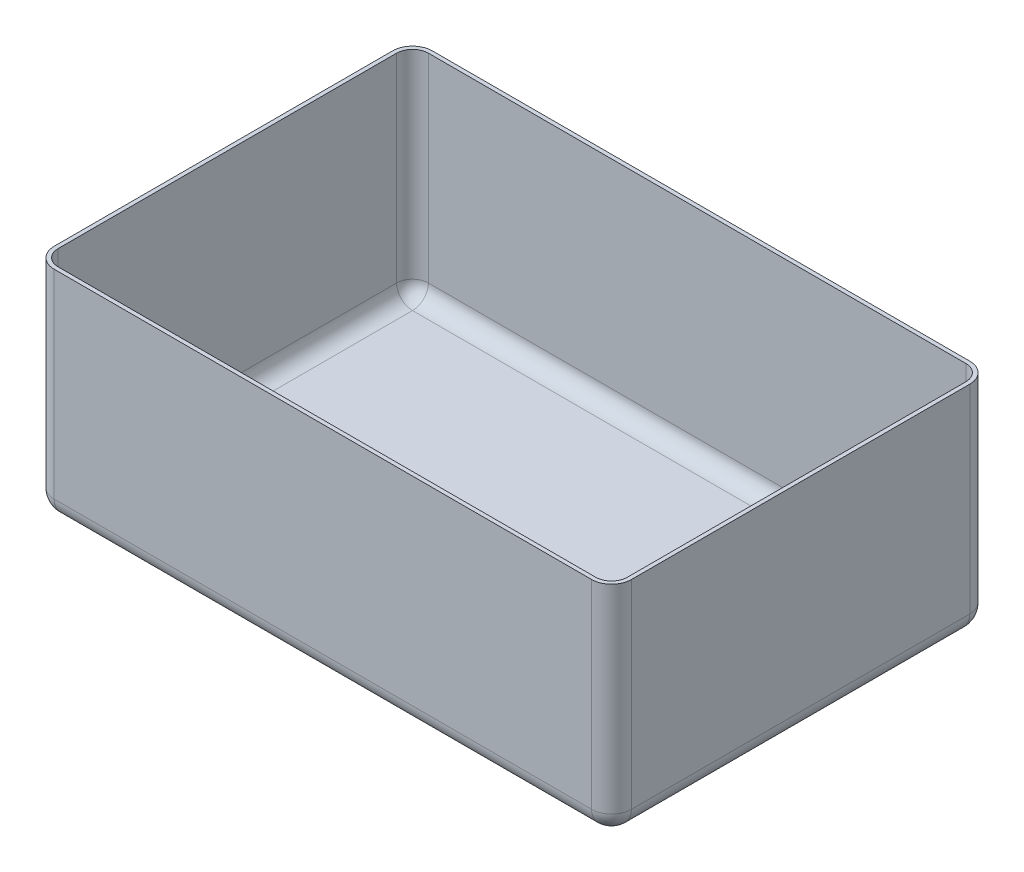
ISO-10303-21;
HEADER;
FILE_DESCRIPTION(('STEP AP214'),'2;1');
FILE_NAME('part.step','',(''),(''),'','','');
FILE_SCHEMA(('AUTOMOTIVE_DESIGN { 1 0 10303 214 1 1 1 1 }'));
ENDSEC;
DATA;
#1=APPLICATION_CONTEXT('core data for automotive mechanical design processes');
#2=APPLICATION_PROTOCOL_DEFINITION('international standard','automotive_design',2000,#1);
#3=PRODUCT_CONTEXT('',#1,'mechanical');
#4=PRODUCT('Part','Part','',(#3));
#5=PRODUCT_RELATED_PRODUCT_CATEGORY('part','',(#4));
#6=PRODUCT_DEFINITION_FORMATION('','',#4);
#7=PRODUCT_DEFINITION_CONTEXT('part definition',#1,'design');
#8=PRODUCT_DEFINITION('design','',#6,#7);
#9=PRODUCT_DEFINITION_SHAPE('','',#8);
#10=(LENGTH_UNIT() NAMED_UNIT(*) SI_UNIT(.MILLI.,.METRE.));
#11=(NAMED_UNIT(*) PLANE_ANGLE_UNIT() SI_UNIT($,.RADIAN.));
#12=(NAMED_UNIT(*) SI_UNIT($,.STERADIAN.) SOLID_ANGLE_UNIT());
#13=UNCERTAINTY_MEASURE_WITH_UNIT(LENGTH_MEASURE(1.E-05),#10,'distance_accuracy_value','');
#14=(GEOMETRIC_REPRESENTATION_CONTEXT(3) GLOBAL_UNCERTAINTY_ASSIGNED_CONTEXT((#13)) GLOBAL_UNIT_ASSIGNED_CONTEXT((#10,
#11,#12)) REPRESENTATION_CONTEXT('',''));
#15=CARTESIAN_POINT('',(0.,0.,0.));
#16=DIRECTION('',(0.,0.,1.));
#17=DIRECTION('',(1.,0.,0.));
#18=AXIS2_PLACEMENT_3D('',#15,#16,#17);
#19=CARTESIAN_POINT('',(184.15,139.7,120.65));
#20=DIRECTION('',(-1.,0.,0.));
#21=DIRECTION('',(0.,0.,1.));
#22=AXIS2_PLACEMENT_3D('',#19,#20,#21);
#23=PLANE('',#22);
#24=DIRECTION('',(0.,0.,-1.));
#25=VECTOR('',#24,1.);
#26=CARTESIAN_POINT('',(184.15,12.7,-120.65));
#27=LINE('',#26,#25);
#28=CARTESIAN_POINT('',(184.15,12.7,107.95));
#29=VERTEX_POINT('',#28);
#30=CARTESIAN_POINT('',(184.15,12.7,-107.95));
#31=VERTEX_POINT('',#30);
#32=EDGE_CURVE('E57',#29,#31,#27,.T.);
#33=ORIENTED_EDGE('',*,*,#32,.T.);
#34=DIRECTION('',(0.,-1.,0.));
#35=VECTOR('',#34,1.);
#36=CARTESIAN_POINT('',(184.15,139.7,-107.95));
#37=LINE('',#36,#35);
#38=CARTESIAN_POINT('',(184.15,139.7,-107.95));
#39=VERTEX_POINT('',#38);
#40=EDGE_CURVE('E285',#31,#39,#37,.F.);
#41=ORIENTED_EDGE('',*,*,#40,.T.);
#42=DIRECTION('',(0.,0.,-1.));
#43=VECTOR('',#42,1.);
#44=CARTESIAN_POINT('',(184.15,139.7,120.65));
#45=LINE('',#44,#43);
#46=CARTESIAN_POINT('',(184.15,139.7,107.95));
#47=VERTEX_POINT('',#46);
#48=EDGE_CURVE('E242',#47,#39,#45,.T.);
#49=ORIENTED_EDGE('',*,*,#48,.F.);
#50=DIRECTION('',(0.,-1.,0.));
#51=VECTOR('',#50,1.);
#52=CARTESIAN_POINT('',(184.15,139.7,107.95));
#53=LINE('',#52,#51);
#54=EDGE_CURVE('E282',#47,#29,#53,.T.);
#55=ORIENTED_EDGE('',*,*,#54,.T.);
#56=EDGE_LOOP('',(#33,#41,#49,#55));
#57=FACE_BOUND('',#56,.T.);
#58=ADVANCED_FACE('F32',(#57),#23,.F.);
#59=CARTESIAN_POINT('',(-184.15,139.7,-120.65));
#60=DIRECTION('',(0.,0.,1.));
#61=DIRECTION('',(1.,0.,0.));
#62=AXIS2_PLACEMENT_3D('',#59,#60,#61);
#63=PLANE('',#62);
#64=DIRECTION('',(-1.,0.,0.));
#65=VECTOR('',#64,1.);
#66=CARTESIAN_POINT('',(-184.15,139.7,-120.65));
#67=LINE('',#66,#65);
#68=CARTESIAN_POINT('',(171.45,139.7,-120.65));
#69=VERTEX_POINT('',#68);
#70=CARTESIAN_POINT('',(-171.45,139.7,-120.65));
#71=VERTEX_POINT('',#70);
#72=EDGE_CURVE('E245',#69,#71,#67,.T.);
#73=ORIENTED_EDGE('',*,*,#72,.F.);
#74=DIRECTION('',(0.,-1.,0.));
#75=VECTOR('',#74,1.);
#76=CARTESIAN_POINT('',(171.45,139.7,-120.65));
#77=LINE('',#76,#75);
#78=CARTESIAN_POINT('',(171.45,12.7,-120.65));
#79=VERTEX_POINT('',#78);
#80=EDGE_CURVE('E259',#69,#79,#77,.T.);
#81=ORIENTED_EDGE('',*,*,#80,.T.);
#82=DIRECTION('',(-1.,0.,0.));
#83=VECTOR('',#82,1.);
#84=CARTESIAN_POINT('',(-184.15,12.7,-120.65));
#85=LINE('',#84,#83);
#86=CARTESIAN_POINT('',(-171.45,12.7,-120.65));
#87=VERTEX_POINT('',#86);
#88=EDGE_CURVE('E256',#79,#87,#85,.T.);
#89=ORIENTED_EDGE('',*,*,#88,.T.);
#90=DIRECTION('',(0.,-1.,0.));
#91=VECTOR('',#90,1.);
#92=CARTESIAN_POINT('',(-171.45,139.7,-120.65));
#93=LINE('',#92,#91);
#94=EDGE_CURVE('E254',#87,#71,#93,.F.);
#95=ORIENTED_EDGE('',*,*,#94,.T.);
#96=EDGE_LOOP('',(#73,#81,#89,#95));
#97=FACE_BOUND('',#96,.T.);
#98=ADVANCED_FACE('F384',(#97),#63,.F.);
#99=CARTESIAN_POINT('',(-184.15,139.7,120.65));
#100=DIRECTION('',(1.,0.,0.));
#101=DIRECTION('',(0.,0.,-1.));
#102=AXIS2_PLACEMENT_3D('',#99,#100,#101);
#103=PLANE('',#102);
#104=DIRECTION('',(0.,0.,1.));
#105=VECTOR('',#104,1.);
#106=CARTESIAN_POINT('',(-184.15,139.7,120.65));
#107=LINE('',#106,#105);
#108=CARTESIAN_POINT('',(-184.15,139.7,-107.95));
#109=VERTEX_POINT('',#108);
#110=CARTESIAN_POINT('',(-184.15,139.7,107.95));
#111=VERTEX_POINT('',#110);
#112=EDGE_CURVE('E248',#109,#111,#107,.T.);
#113=ORIENTED_EDGE('',*,*,#112,.F.);
#114=DIRECTION('',(0.,-1.,0.));
#115=VECTOR('',#114,1.);
#116=CARTESIAN_POINT('',(-184.15,139.7,-107.95));
#117=LINE('',#116,#115);
#118=CARTESIAN_POINT('',(-184.15,12.7,-107.95));
#119=VERTEX_POINT('',#118);
#120=EDGE_CURVE('E274',#109,#119,#117,.T.);
#121=ORIENTED_EDGE('',*,*,#120,.T.);
#122=DIRECTION('',(0.,0.,1.));
#123=VECTOR('',#122,1.);
#124=CARTESIAN_POINT('',(-184.15,12.7,120.65));
#125=LINE('',#124,#123);
#126=CARTESIAN_POINT('',(-184.15,12.7,107.95));
#127=VERTEX_POINT('',#126);
#128=EDGE_CURVE('E272',#119,#127,#125,.T.);
#129=ORIENTED_EDGE('',*,*,#128,.T.);
#130=DIRECTION('',(0.,-1.,0.));
#131=VECTOR('',#130,1.);
#132=CARTESIAN_POINT('',(-184.15,139.7,107.95));
#133=LINE('',#132,#131);
#134=EDGE_CURVE('E270',#127,#111,#133,.F.);
#135=ORIENTED_EDGE('',*,*,#134,.T.);
#136=EDGE_LOOP('',(#113,#121,#129,#135));
#137=FACE_BOUND('',#136,.T.);
#138=ADVANCED_FACE('F387',(#137),#103,.F.);
#139=CARTESIAN_POINT('',(-184.15,139.7,120.65));
#140=DIRECTION('',(0.,0.,-1.));
#141=DIRECTION('',(-1.,0.,0.));
#142=AXIS2_PLACEMENT_3D('',#139,#140,#141);
#143=PLANE('',#142);
#144=DIRECTION('',(1.,0.,0.));
#145=VECTOR('',#144,1.);
#146=CARTESIAN_POINT('',(184.15,12.7,120.65));
#147=LINE('',#146,#145);
#148=CARTESIAN_POINT('',(-171.45,12.7,120.65));
#149=VERTEX_POINT('',#148);
#150=CARTESIAN_POINT('',(171.45,12.7,120.65));
#151=VERTEX_POINT('',#150);
#152=EDGE_CURVE('E278',#149,#151,#147,.T.);
#153=ORIENTED_EDGE('',*,*,#152,.T.);
#154=DIRECTION('',(0.,-1.,0.));
#155=VECTOR('',#154,1.);
#156=CARTESIAN_POINT('',(171.45,139.7,120.65));
#157=LINE('',#156,#155);
#158=CARTESIAN_POINT('',(171.45,139.7,120.65));
#159=VERTEX_POINT('',#158);
#160=EDGE_CURVE('E280',#151,#159,#157,.F.);
#161=ORIENTED_EDGE('',*,*,#160,.T.);
#162=DIRECTION('',(1.,0.,0.));
#163=VECTOR('',#162,1.);
#164=CARTESIAN_POINT('',(-184.15,139.7,120.65));
#165=LINE('',#164,#163);
#166=CARTESIAN_POINT('',(-171.45,139.7,120.65));
#167=VERTEX_POINT('',#166);
#168=EDGE_CURVE('E251',#167,#159,#165,.T.);
#169=ORIENTED_EDGE('',*,*,#168,.F.);
#170=DIRECTION('',(0.,-1.,0.));
#171=VECTOR('',#170,1.);
#172=CARTESIAN_POINT('',(-171.45,139.7,120.65));
#173=LINE('',#172,#171);
#174=EDGE_CURVE('E276',#167,#149,#173,.T.);
#175=ORIENTED_EDGE('',*,*,#174,.T.);
#176=EDGE_LOOP('',(#153,#161,#169,#175));
#177=FACE_BOUND('',#176,.T.);
#178=ADVANCED_FACE('F352',(#177),#143,.F.);
#179=CARTESIAN_POINT('',(0.,139.7,0.));
#180=DIRECTION('',(0.,-1.,0.));
#181=DIRECTION('',(0.,0.,-1.));
#182=AXIS2_PLACEMENT_3D('',#179,#180,#181);
#183=PLANE('',#182);
#184=DIRECTION('',(0.,0.,-1.));
#185=VECTOR('',#184,1.);
#186=CARTESIAN_POINT('',(181.61,139.7,0.));
#187=LINE('',#186,#185);
#188=CARTESIAN_POINT('',(181.61,139.7,107.95));
#189=VERTEX_POINT('',#188);
#190=CARTESIAN_POINT('',(181.61,139.7,-107.95));
#191=VERTEX_POINT('',#190);
#192=EDGE_CURVE('E189',#189,#191,#187,.T.);
#193=ORIENTED_EDGE('',*,*,#192,.F.);
#194=CARTESIAN_POINT('',(171.45,139.7,107.95));
#195=DIRECTION('',(0.,-1.,0.));
#196=DIRECTION('',(0.,0.,-1.));
#197=AXIS2_PLACEMENT_3D('',#194,#195,#196);
#198=CIRCLE('',#197,10.16);
#199=CARTESIAN_POINT('',(171.45,139.7,118.11));
#200=VERTEX_POINT('',#199);
#201=EDGE_CURVE('E231',#200,#189,#198,.F.);
#202=ORIENTED_EDGE('',*,*,#201,.F.);
#203=DIRECTION('',(1.,0.,0.));
#204=VECTOR('',#203,1.);
#205=CARTESIAN_POINT('',(0.,139.7,118.11));
#206=LINE('',#205,#204);
#207=CARTESIAN_POINT('',(-171.45,139.7,118.11));
#208=VERTEX_POINT('',#207);
#209=EDGE_CURVE('E49',#208,#200,#206,.T.);
#210=ORIENTED_EDGE('',*,*,#209,.F.);
#211=CARTESIAN_POINT('',(-171.45,139.7,107.95));
#212=DIRECTION('',(0.,-1.,0.));
#213=DIRECTION('',(0.,0.,-1.));
#214=AXIS2_PLACEMENT_3D('',#211,#212,#213);
#215=CIRCLE('',#214,10.16);
#216=CARTESIAN_POINT('',(-181.61,139.7,107.95));
#217=VERTEX_POINT('',#216);
#218=EDGE_CURVE('E193',#217,#208,#215,.F.);
#219=ORIENTED_EDGE('',*,*,#218,.F.);
#220=DIRECTION('',(0.,0.,1.));
#221=VECTOR('',#220,1.);
#222=CARTESIAN_POINT('',(-181.61,139.7,0.));
#223=LINE('',#222,#221);
#224=CARTESIAN_POINT('',(-181.61,139.7,-107.95));
#225=VERTEX_POINT('',#224);
#226=EDGE_CURVE('E234',#225,#217,#223,.T.);
#227=ORIENTED_EDGE('',*,*,#226,.F.);
#228=CARTESIAN_POINT('',(-171.45,139.7,-107.95));
#229=DIRECTION('',(0.,-1.,0.));
#230=DIRECTION('',(0.,0.,-1.));
#231=AXIS2_PLACEMENT_3D('',#228,#229,#230);
#232=CIRCLE('',#231,10.16);
#233=CARTESIAN_POINT('',(-171.45,139.7,-118.11));
#234=VERTEX_POINT('',#233);
#235=EDGE_CURVE('E235',#234,#225,#232,.F.);
#236=ORIENTED_EDGE('',*,*,#235,.F.);
#237=DIRECTION('',(-1.,0.,0.));
#238=VECTOR('',#237,1.);
#239=CARTESIAN_POINT('',(0.,139.7,-118.11));
#240=LINE('',#239,#238);
#241=CARTESIAN_POINT('',(171.45,139.7,-118.11));
#242=VERTEX_POINT('',#241);
#243=EDGE_CURVE('E226',#242,#234,#240,.T.);
#244=ORIENTED_EDGE('',*,*,#243,.F.);
#245=CARTESIAN_POINT('',(171.45,139.7,-107.95));
#246=DIRECTION('',(0.,-1.,0.));
#247=DIRECTION('',(0.,0.,-1.));
#248=AXIS2_PLACEMENT_3D('',#245,#246,#247);
#249=CIRCLE('',#248,10.16);
#250=EDGE_CURVE('E228',#191,#242,#249,.F.);
#251=ORIENTED_EDGE('',*,*,#250,.F.);
#252=EDGE_LOOP('',(#193,#202,#210,#219,#227,#236,#244,#251));
#253=FACE_BOUND('',#252,.T.);
#254=ORIENTED_EDGE('',*,*,#48,.T.);
#255=CARTESIAN_POINT('',(171.45,139.7,-107.95));
#256=DIRECTION('',(0.,-1.,0.));
#257=DIRECTION('',(0.,0.,-1.));
#258=AXIS2_PLACEMENT_3D('',#255,#256,#257);
#259=CIRCLE('',#258,12.7);
#260=EDGE_CURVE('E11',#39,#69,#259,.F.);
#261=ORIENTED_EDGE('',*,*,#260,.T.);
#262=ORIENTED_EDGE('',*,*,#72,.T.);
#263=CARTESIAN_POINT('',(-171.45,139.7,-107.95));
#264=DIRECTION('',(0.,-1.,0.));
#265=DIRECTION('',(0.,0.,-1.));
#266=AXIS2_PLACEMENT_3D('',#263,#264,#265);
#267=CIRCLE('',#266,12.7);
#268=EDGE_CURVE('E289',#71,#109,#267,.F.);
#269=ORIENTED_EDGE('',*,*,#268,.T.);
#270=ORIENTED_EDGE('',*,*,#112,.T.);
#271=CARTESIAN_POINT('',(-171.45,139.7,107.95));
#272=DIRECTION('',(0.,-1.,0.));
#273=DIRECTION('',(0.,0.,-1.));
#274=AXIS2_PLACEMENT_3D('',#271,#272,#273);
#275=CIRCLE('',#274,12.7);
#276=EDGE_CURVE('E287',#111,#167,#275,.F.);
#277=ORIENTED_EDGE('',*,*,#276,.T.);
#278=ORIENTED_EDGE('',*,*,#168,.T.);
#279=CARTESIAN_POINT('',(171.45,139.7,107.95));
#280=DIRECTION('',(0.,-1.,0.));
#281=DIRECTION('',(0.,0.,-1.));
#282=AXIS2_PLACEMENT_3D('',#279,#280,#281);
#283=CIRCLE('',#282,12.7);
#284=EDGE_CURVE('E41',#159,#47,#283,.F.);
#285=ORIENTED_EDGE('',*,*,#284,.T.);
#286=EDGE_LOOP('',(#254,#261,#262,#269,#270,#277,#278,#285));
#287=FACE_BOUND('',#286,.T.);
#288=ADVANCED_FACE('F345',(#253,#287),#183,.F.);
#289=CARTESIAN_POINT('',(0.,0.,0.));
#290=DIRECTION('',(0.,-1.,0.));
#291=DIRECTION('',(0.,0.,-1.));
#292=AXIS2_PLACEMENT_3D('',#289,#290,#291);
#293=PLANE('',#292);
#294=DIRECTION('',(0.,0.,1.));
#295=VECTOR('',#294,1.);
#296=CARTESIAN_POINT('',(-171.45,0.,-120.65));
#297=LINE('',#296,#295);
#298=CARTESIAN_POINT('',(-171.45,0.,107.95));
#299=VERTEX_POINT('',#298);
#300=CARTESIAN_POINT('',(-171.45,0.,-107.95));
#301=VERTEX_POINT('',#300);
#302=EDGE_CURVE('E265',#299,#301,#297,.F.);
#303=ORIENTED_EDGE('',*,*,#302,.T.);
#304=DIRECTION('',(-1.,0.,0.));
#305=VECTOR('',#304,1.);
#306=CARTESIAN_POINT('',(184.15,0.,-107.95));
#307=LINE('',#306,#305);
#308=CARTESIAN_POINT('',(171.45,0.,-107.95));
#309=VERTEX_POINT('',#308);
#310=EDGE_CURVE('E267',#301,#309,#307,.F.);
#311=ORIENTED_EDGE('',*,*,#310,.T.);
#312=DIRECTION('',(0.,0.,-1.));
#313=VECTOR('',#312,1.);
#314=CARTESIAN_POINT('',(171.45,0.,120.65));
#315=LINE('',#314,#313);
#316=CARTESIAN_POINT('',(171.45,0.,107.95));
#317=VERTEX_POINT('',#316);
#318=EDGE_CURVE('E261',#309,#317,#315,.F.);
#319=ORIENTED_EDGE('',*,*,#318,.T.);
#320=DIRECTION('',(1.,0.,0.));
#321=VECTOR('',#320,1.);
#322=CARTESIAN_POINT('',(-184.15,0.,107.95));
#323=LINE('',#322,#321);
#324=EDGE_CURVE('E263',#317,#299,#323,.F.);
#325=ORIENTED_EDGE('',*,*,#324,.T.);
#326=EDGE_LOOP('',(#303,#311,#319,#325));
#327=FACE_BOUND('',#326,.T.);
#328=ADVANCED_FACE('F371',(#327),#293,.T.);
#329=CARTESIAN_POINT('',(171.45,139.7,107.95));
#330=DIRECTION('',(0.,-1.,0.));
#331=DIRECTION('',(0.,0.,-1.));
#332=AXIS2_PLACEMENT_3D('',#329,#330,#331);
#333=CYLINDRICAL_SURFACE('',#332,12.7);
#334=ORIENTED_EDGE('',*,*,#284,.F.);
#335=ORIENTED_EDGE('',*,*,#160,.F.);
#336=CARTESIAN_POINT('',(171.45,12.7,107.95));
#337=DIRECTION('',(0.,-1.,0.));
#338=DIRECTION('',(0.,0.,-1.));
#339=AXIS2_PLACEMENT_3D('',#336,#337,#338);
#340=CIRCLE('',#339,12.7);
#341=EDGE_CURVE('E318',#29,#151,#340,.T.);
#342=ORIENTED_EDGE('',*,*,#341,.F.);
#343=ORIENTED_EDGE('',*,*,#54,.F.);
#344=EDGE_LOOP('',(#334,#335,#342,#343));
#345=FACE_BOUND('',#344,.T.);
#346=ADVANCED_FACE('F34',(#345),#333,.T.);
#347=CARTESIAN_POINT('',(-171.45,139.7,107.95));
#348=DIRECTION('',(0.,-1.,0.));
#349=DIRECTION('',(0.,0.,-1.));
#350=AXIS2_PLACEMENT_3D('',#347,#348,#349);
#351=CYLINDRICAL_SURFACE('',#350,12.7);
#352=ORIENTED_EDGE('',*,*,#276,.F.);
#353=ORIENTED_EDGE('',*,*,#134,.F.);
#354=CARTESIAN_POINT('',(-171.45,12.7,107.95));
#355=DIRECTION('',(0.,-1.,0.));
#356=DIRECTION('',(0.,0.,-1.));
#357=AXIS2_PLACEMENT_3D('',#354,#355,#356);
#358=CIRCLE('',#357,12.7);
#359=EDGE_CURVE('E316',#149,#127,#358,.T.);
#360=ORIENTED_EDGE('',*,*,#359,.F.);
#361=ORIENTED_EDGE('',*,*,#174,.F.);
#362=EDGE_LOOP('',(#352,#353,#360,#361));
#363=FACE_BOUND('',#362,.T.);
#364=ADVANCED_FACE('F361',(#363),#351,.T.);
#365=CARTESIAN_POINT('',(-184.15,12.7,107.95));
#366=DIRECTION('',(-1.,0.,0.));
#367=DIRECTION('',(0.,0.,1.));
#368=AXIS2_PLACEMENT_3D('',#365,#366,#367);
#369=CYLINDRICAL_SURFACE('',#368,12.7);
#370=CARTESIAN_POINT('',(171.45,12.7,107.95));
#371=DIRECTION('',(1.,0.,0.));
#372=DIRECTION('',(0.,0.,-1.));
#373=AXIS2_PLACEMENT_3D('',#370,#371,#372);
#374=CIRCLE('',#373,12.7);
#375=EDGE_CURVE('E36',#151,#317,#374,.T.);
#376=ORIENTED_EDGE('',*,*,#375,.F.);
#377=ORIENTED_EDGE('',*,*,#152,.F.);
#378=CARTESIAN_POINT('',(-171.45,12.7,107.95));
#379=DIRECTION('',(-1.,0.,0.));
#380=DIRECTION('',(0.,0.,1.));
#381=AXIS2_PLACEMENT_3D('',#378,#379,#380);
#382=CIRCLE('',#381,12.7);
#383=EDGE_CURVE('E313',#299,#149,#382,.T.);
#384=ORIENTED_EDGE('',*,*,#383,.F.);
#385=ORIENTED_EDGE('',*,*,#324,.F.);
#386=EDGE_LOOP('',(#376,#377,#384,#385));
#387=FACE_BOUND('',#386,.T.);
#388=ADVANCED_FACE('F356',(#387),#369,.T.);
#389=CARTESIAN_POINT('',(171.45,12.7,107.95));
#390=DIRECTION('',(0.,0.,1.));
#391=DIRECTION('',(1.,0.,0.));
#392=AXIS2_PLACEMENT_3D('',#389,#390,#391);
#393=SPHERICAL_SURFACE('',#392,12.7);
#394=ORIENTED_EDGE('',*,*,#341,.T.);
#395=ORIENTED_EDGE('',*,*,#375,.T.);
#396=CARTESIAN_POINT('',(171.45,12.7,107.95));
#397=DIRECTION('',(0.,0.,1.));
#398=DIRECTION('',(1.,0.,0.));
#399=AXIS2_PLACEMENT_3D('',#396,#397,#398);
#400=CIRCLE('',#399,12.7);
#401=EDGE_CURVE('E310',#29,#317,#400,.F.);
#402=ORIENTED_EDGE('',*,*,#401,.F.);
#403=EDGE_LOOP('',(#394,#395,#402));
#404=FACE_BOUND('',#403,.T.);
#405=ADVANCED_FACE('F325',(#404),#393,.T.);
#406=CARTESIAN_POINT('',(-171.45,12.7,107.95));
#407=DIRECTION('',(0.,0.,1.));
#408=DIRECTION('',(1.,0.,0.));
#409=AXIS2_PLACEMENT_3D('',#406,#407,#408);
#410=SPHERICAL_SURFACE('',#409,12.7);
#411=ORIENTED_EDGE('',*,*,#383,.T.);
#412=ORIENTED_EDGE('',*,*,#359,.T.);
#413=CARTESIAN_POINT('',(-171.45,12.7,107.95));
#414=DIRECTION('',(0.,0.,1.));
#415=DIRECTION('',(1.,0.,0.));
#416=AXIS2_PLACEMENT_3D('',#413,#414,#415);
#417=CIRCLE('',#416,12.7);
#418=EDGE_CURVE('E307',#299,#127,#417,.F.);
#419=ORIENTED_EDGE('',*,*,#418,.F.);
#420=EDGE_LOOP('',(#411,#412,#419));
#421=FACE_BOUND('',#420,.T.);
#422=ADVANCED_FACE('F363',(#421),#410,.T.);
#423=CARTESIAN_POINT('',(171.45,12.7,120.65));
#424=DIRECTION('',(0.,0.,1.));
#425=DIRECTION('',(1.,0.,0.));
#426=AXIS2_PLACEMENT_3D('',#423,#424,#425);
#427=CYLINDRICAL_SURFACE('',#426,12.7);
#428=ORIENTED_EDGE('',*,*,#401,.T.);
#429=ORIENTED_EDGE('',*,*,#318,.F.);
#430=CARTESIAN_POINT('',(171.45,12.7,-107.95));
#431=DIRECTION('',(0.,0.,-1.));
#432=DIRECTION('',(-1.,0.,0.));
#433=AXIS2_PLACEMENT_3D('',#430,#431,#432);
#434=CIRCLE('',#433,12.7);
#435=EDGE_CURVE('E304',#31,#309,#434,.T.);
#436=ORIENTED_EDGE('',*,*,#435,.F.);
#437=ORIENTED_EDGE('',*,*,#32,.F.);
#438=EDGE_LOOP('',(#428,#429,#436,#437));
#439=FACE_BOUND('',#438,.T.);
#440=ADVANCED_FACE('F331',(#439),#427,.T.);
#441=CARTESIAN_POINT('',(171.45,139.7,-107.95));
#442=DIRECTION('',(0.,-1.,0.));
#443=DIRECTION('',(0.,0.,-1.));
#444=AXIS2_PLACEMENT_3D('',#441,#442,#443);
#445=CYLINDRICAL_SURFACE('',#444,12.7);
#446=ORIENTED_EDGE('',*,*,#260,.F.);
#447=ORIENTED_EDGE('',*,*,#40,.F.);
#448=CARTESIAN_POINT('',(171.45,12.7,-107.95));
#449=DIRECTION('',(0.,-1.,0.));
#450=DIRECTION('',(0.,0.,-1.));
#451=AXIS2_PLACEMENT_3D('',#448,#449,#450);
#452=CIRCLE('',#451,12.7);
#453=EDGE_CURVE('E301',#79,#31,#452,.T.);
#454=ORIENTED_EDGE('',*,*,#453,.F.);
#455=ORIENTED_EDGE('',*,*,#80,.F.);
#456=EDGE_LOOP('',(#446,#447,#454,#455));
#457=FACE_BOUND('',#456,.T.);
#458=ADVANCED_FACE('F341',(#457),#445,.T.);
#459=CARTESIAN_POINT('',(-171.45,139.7,-107.95));
#460=DIRECTION('',(0.,-1.,0.));
#461=DIRECTION('',(0.,0.,-1.));
#462=AXIS2_PLACEMENT_3D('',#459,#460,#461);
#463=CYLINDRICAL_SURFACE('',#462,12.7);
#464=ORIENTED_EDGE('',*,*,#268,.F.);
#465=ORIENTED_EDGE('',*,*,#94,.F.);
#466=CARTESIAN_POINT('',(-171.45,12.7,-107.95));
#467=DIRECTION('',(0.,-1.,0.));
#468=DIRECTION('',(0.,0.,-1.));
#469=AXIS2_PLACEMENT_3D('',#466,#467,#468);
#470=CIRCLE('',#469,12.7);
#471=EDGE_CURVE('E298',#119,#87,#470,.T.);
#472=ORIENTED_EDGE('',*,*,#471,.F.);
#473=ORIENTED_EDGE('',*,*,#120,.F.);
#474=EDGE_LOOP('',(#464,#465,#472,#473));
#475=FACE_BOUND('',#474,.T.);
#476=ADVANCED_FACE('F382',(#475),#463,.T.);
#477=CARTESIAN_POINT('',(-171.45,12.7,120.65));
#478=DIRECTION('',(0.,0.,-1.));
#479=DIRECTION('',(-1.,0.,0.));
#480=AXIS2_PLACEMENT_3D('',#477,#478,#479);
#481=CYLINDRICAL_SURFACE('',#480,12.7);
#482=ORIENTED_EDGE('',*,*,#418,.T.);
#483=ORIENTED_EDGE('',*,*,#128,.F.);
#484=CARTESIAN_POINT('',(-171.45,12.7,-107.95));
#485=DIRECTION('',(0.,0.,-1.));
#486=DIRECTION('',(-1.,0.,0.));
#487=AXIS2_PLACEMENT_3D('',#484,#485,#486);
#488=CIRCLE('',#487,12.7);
#489=EDGE_CURVE('E295',#301,#119,#488,.T.);
#490=ORIENTED_EDGE('',*,*,#489,.F.);
#491=ORIENTED_EDGE('',*,*,#302,.F.);
#492=EDGE_LOOP('',(#482,#483,#490,#491));
#493=FACE_BOUND('',#492,.T.);
#494=ADVANCED_FACE('F368',(#493),#481,.T.);
#495=CARTESIAN_POINT('',(171.45,12.7,-107.95));
#496=DIRECTION('',(0.,0.,1.));
#497=DIRECTION('',(1.,0.,0.));
#498=AXIS2_PLACEMENT_3D('',#495,#496,#497);
#499=SPHERICAL_SURFACE('',#498,12.7);
#500=ORIENTED_EDGE('',*,*,#453,.T.);
#501=ORIENTED_EDGE('',*,*,#435,.T.);
#502=CARTESIAN_POINT('',(171.45,12.7,-107.95));
#503=DIRECTION('',(1.,0.,0.));
#504=DIRECTION('',(0.,0.,-1.));
#505=AXIS2_PLACEMENT_3D('',#502,#503,#504);
#506=CIRCLE('',#505,12.7);
#507=EDGE_CURVE('E293',#79,#309,#506,.F.);
#508=ORIENTED_EDGE('',*,*,#507,.F.);
#509=EDGE_LOOP('',(#500,#501,#508));
#510=FACE_BOUND('',#509,.T.);
#511=ADVANCED_FACE('F336',(#510),#499,.T.);
#512=CARTESIAN_POINT('',(-171.45,12.7,-107.95));
#513=DIRECTION('',(0.,0.,1.));
#514=DIRECTION('',(1.,0.,0.));
#515=AXIS2_PLACEMENT_3D('',#512,#513,#514);
#516=SPHERICAL_SURFACE('',#515,12.7);
#517=ORIENTED_EDGE('',*,*,#489,.T.);
#518=ORIENTED_EDGE('',*,*,#471,.T.);
#519=CARTESIAN_POINT('',(-171.45,12.7,-107.95));
#520=DIRECTION('',(-1.,0.,0.));
#521=DIRECTION('',(0.,0.,1.));
#522=AXIS2_PLACEMENT_3D('',#519,#520,#521);
#523=CIRCLE('',#522,12.7);
#524=EDGE_CURVE('E230',#301,#87,#523,.F.);
#525=ORIENTED_EDGE('',*,*,#524,.F.);
#526=EDGE_LOOP('',(#517,#518,#525));
#527=FACE_BOUND('',#526,.T.);
#528=ADVANCED_FACE('F376',(#527),#516,.T.);
#529=CARTESIAN_POINT('',(-184.15,12.7,-107.95));
#530=DIRECTION('',(1.,0.,0.));
#531=DIRECTION('',(0.,0.,-1.));
#532=AXIS2_PLACEMENT_3D('',#529,#530,#531);
#533=CYLINDRICAL_SURFACE('',#532,12.7);
#534=ORIENTED_EDGE('',*,*,#507,.T.);
#535=ORIENTED_EDGE('',*,*,#310,.F.);
#536=ORIENTED_EDGE('',*,*,#524,.T.);
#537=ORIENTED_EDGE('',*,*,#88,.F.);
#538=EDGE_LOOP('',(#534,#535,#536,#537));
#539=FACE_BOUND('',#538,.T.);
#540=ADVANCED_FACE('F374',(#539),#533,.T.);
#541=CARTESIAN_POINT('',(181.61,139.7,120.65));
#542=DIRECTION('',(-1.,0.,0.));
#543=DIRECTION('',(0.,0.,1.));
#544=AXIS2_PLACEMENT_3D('',#541,#542,#543);
#545=PLANE('',#544);
#546=DIRECTION('',(0.,0.,1.));
#547=VECTOR('',#546,1.);
#548=CARTESIAN_POINT('',(181.61,12.7,120.65));
#549=LINE('',#548,#547);
#550=CARTESIAN_POINT('',(181.61,12.7,107.95));
#551=VERTEX_POINT('',#550);
#552=CARTESIAN_POINT('',(181.61,12.7,-107.95));
#553=VERTEX_POINT('',#552);
#554=EDGE_CURVE('E173',#551,#553,#549,.F.);
#555=ORIENTED_EDGE('',*,*,#554,.F.);
#556=DIRECTION('',(0.,1.,0.));
#557=VECTOR('',#556,1.);
#558=CARTESIAN_POINT('',(181.61,139.7,107.95));
#559=LINE('',#558,#557);
#560=EDGE_CURVE('E184',#189,#551,#559,.F.);
#561=ORIENTED_EDGE('',*,*,#560,.F.);
#562=ORIENTED_EDGE('',*,*,#192,.T.);
#563=DIRECTION('',(0.,1.,0.));
#564=VECTOR('',#563,1.);
#565=CARTESIAN_POINT('',(181.61,139.7,-107.95));
#566=LINE('',#565,#564);
#567=EDGE_CURVE('E183',#553,#191,#566,.T.);
#568=ORIENTED_EDGE('',*,*,#567,.F.);
#569=EDGE_LOOP('',(#555,#561,#562,#568));
#570=FACE_BOUND('',#569,.T.);
#571=ADVANCED_FACE('F187',(#570),#545,.T.);
#572=CARTESIAN_POINT('',(-184.15,139.7,-118.11));
#573=DIRECTION('',(0.,0.,1.));
#574=DIRECTION('',(1.,0.,0.));
#575=AXIS2_PLACEMENT_3D('',#572,#573,#574);
#576=PLANE('',#575);
#577=ORIENTED_EDGE('',*,*,#243,.T.);
#578=DIRECTION('',(0.,1.,0.));
#579=VECTOR('',#578,1.);
#580=CARTESIAN_POINT('',(-171.45,139.7,-118.11));
#581=LINE('',#580,#579);
#582=CARTESIAN_POINT('',(-171.45,12.7,-118.11));
#583=VERTEX_POINT('',#582);
#584=EDGE_CURVE('E218',#583,#234,#581,.T.);
#585=ORIENTED_EDGE('',*,*,#584,.F.);
#586=DIRECTION('',(1.,0.,0.));
#587=VECTOR('',#586,1.);
#588=CARTESIAN_POINT('',(-184.15,12.7,-118.11));
#589=LINE('',#588,#587);
#590=CARTESIAN_POINT('',(171.45,12.7,-118.11));
#591=VERTEX_POINT('',#590);
#592=EDGE_CURVE('E215',#591,#583,#589,.F.);
#593=ORIENTED_EDGE('',*,*,#592,.F.);
#594=DIRECTION('',(0.,1.,0.));
#595=VECTOR('',#594,1.);
#596=CARTESIAN_POINT('',(171.45,139.7,-118.11));
#597=LINE('',#596,#595);
#598=EDGE_CURVE('E205',#242,#591,#597,.F.);
#599=ORIENTED_EDGE('',*,*,#598,.F.);
#600=EDGE_LOOP('',(#577,#585,#593,#599));
#601=FACE_BOUND('',#600,.T.);
#602=ADVANCED_FACE('F486',(#601),#576,.T.);
#603=CARTESIAN_POINT('',(-181.61,139.7,120.65));
#604=DIRECTION('',(1.,0.,0.));
#605=DIRECTION('',(0.,0.,-1.));
#606=AXIS2_PLACEMENT_3D('',#603,#604,#605);
#607=PLANE('',#606);
#608=ORIENTED_EDGE('',*,*,#226,.T.);
#609=DIRECTION('',(0.,1.,0.));
#610=VECTOR('',#609,1.);
#611=CARTESIAN_POINT('',(-181.61,139.7,107.95));
#612=LINE('',#611,#610);
#613=CARTESIAN_POINT('',(-181.61,12.7,107.95));
#614=VERTEX_POINT('',#613);
#615=EDGE_CURVE('E708',#614,#217,#612,.T.);
#616=ORIENTED_EDGE('',*,*,#615,.F.);
#617=DIRECTION('',(0.,0.,-1.));
#618=VECTOR('',#617,1.);
#619=CARTESIAN_POINT('',(-181.61,12.7,120.65));
#620=LINE('',#619,#618);
#621=CARTESIAN_POINT('',(-181.61,12.7,-107.95));
#622=VERTEX_POINT('',#621);
#623=EDGE_CURVE('E702',#622,#614,#620,.F.);
#624=ORIENTED_EDGE('',*,*,#623,.F.);
#625=DIRECTION('',(0.,1.,0.));
#626=VECTOR('',#625,1.);
#627=CARTESIAN_POINT('',(-181.61,139.7,-107.95));
#628=LINE('',#627,#626);
#629=EDGE_CURVE('E699',#225,#622,#628,.F.);
#630=ORIENTED_EDGE('',*,*,#629,.F.);
#631=EDGE_LOOP('',(#608,#616,#624,#630));
#632=FACE_BOUND('',#631,.T.);
#633=ADVANCED_FACE('F483',(#632),#607,.T.);
#634=CARTESIAN_POINT('',(-184.15,139.7,118.11));
#635=DIRECTION('',(0.,0.,-1.));
#636=DIRECTION('',(-1.,0.,0.));
#637=AXIS2_PLACEMENT_3D('',#634,#635,#636);
#638=PLANE('',#637);
#639=DIRECTION('',(-1.,0.,0.));
#640=VECTOR('',#639,1.);
#641=CARTESIAN_POINT('',(-184.15,12.7,118.11));
#642=LINE('',#641,#640);
#643=CARTESIAN_POINT('',(-171.45,12.7,118.11));
#644=VERTEX_POINT('',#643);
#645=CARTESIAN_POINT('',(171.45,12.7,118.11));
#646=VERTEX_POINT('',#645);
#647=EDGE_CURVE('E706',#644,#646,#642,.F.);
#648=ORIENTED_EDGE('',*,*,#647,.F.);
#649=DIRECTION('',(0.,1.,0.));
#650=VECTOR('',#649,1.);
#651=CARTESIAN_POINT('',(-171.45,139.7,118.11));
#652=LINE('',#651,#650);
#653=EDGE_CURVE('E704',#208,#644,#652,.F.);
#654=ORIENTED_EDGE('',*,*,#653,.F.);
#655=ORIENTED_EDGE('',*,*,#209,.T.);
#656=DIRECTION('',(0.,1.,0.));
#657=VECTOR('',#656,1.);
#658=CARTESIAN_POINT('',(171.45,139.7,118.11));
#659=LINE('',#658,#657);
#660=EDGE_CURVE('E736',#646,#200,#659,.T.);
#661=ORIENTED_EDGE('',*,*,#660,.F.);
#662=EDGE_LOOP('',(#648,#654,#655,#661));
#663=FACE_BOUND('',#662,.T.);
#664=ADVANCED_FACE('F479',(#663),#638,.T.);
#665=CARTESIAN_POINT('',(0.,2.54,0.));
#666=DIRECTION('',(0.,-1.,0.));
#667=DIRECTION('',(0.,0.,-1.));
#668=AXIS2_PLACEMENT_3D('',#665,#666,#667);
#669=PLANE('',#668);
#670=DIRECTION('',(0.,0.,-1.));
#671=VECTOR('',#670,1.);
#672=CARTESIAN_POINT('',(-171.45,2.54,0.));
#673=LINE('',#672,#671);
#674=CARTESIAN_POINT('',(-171.45,2.54,107.95));
#675=VERTEX_POINT('',#674);
#676=CARTESIAN_POINT('',(-171.45,2.54,-107.95));
#677=VERTEX_POINT('',#676);
#678=EDGE_CURVE('E719',#675,#677,#673,.T.);
#679=ORIENTED_EDGE('',*,*,#678,.F.);
#680=DIRECTION('',(1.,0.,0.));
#681=VECTOR('',#680,1.);
#682=CARTESIAN_POINT('',(0.,2.54,107.95));
#683=LINE('',#682,#681);
#684=CARTESIAN_POINT('',(171.45,2.54,107.95));
#685=VERTEX_POINT('',#684);
#686=EDGE_CURVE('E722',#685,#675,#683,.F.);
#687=ORIENTED_EDGE('',*,*,#686,.F.);
#688=DIRECTION('',(0.,0.,-1.));
#689=VECTOR('',#688,1.);
#690=CARTESIAN_POINT('',(171.45,2.54,0.));
#691=LINE('',#690,#689);
#692=CARTESIAN_POINT('',(171.45,2.53999999999999,-107.95));
#693=VERTEX_POINT('',#692);
#694=EDGE_CURVE('E214',#693,#685,#691,.F.);
#695=ORIENTED_EDGE('',*,*,#694,.F.);
#696=DIRECTION('',(1.,0.,0.));
#697=VECTOR('',#696,1.);
#698=CARTESIAN_POINT('',(0.,2.54,-107.95));
#699=LINE('',#698,#697);
#700=EDGE_CURVE('E721',#677,#693,#699,.T.);
#701=ORIENTED_EDGE('',*,*,#700,.F.);
#702=EDGE_LOOP('',(#679,#687,#695,#701));
#703=FACE_BOUND('',#702,.T.);
#704=ADVANCED_FACE('F475',(#703),#669,.F.);
#705=CARTESIAN_POINT('',(171.45,139.7,107.95));
#706=DIRECTION('',(0.,-1.,0.));
#707=DIRECTION('',(0.,0.,-1.));
#708=AXIS2_PLACEMENT_3D('',#705,#706,#707);
#709=CYLINDRICAL_SURFACE('',#708,10.16);
#710=ORIENTED_EDGE('',*,*,#201,.T.);
#711=ORIENTED_EDGE('',*,*,#560,.T.);
#712=CARTESIAN_POINT('',(171.45,12.7,107.95));
#713=DIRECTION('',(0.,-1.,0.));
#714=DIRECTION('',(1.,0.,0.));
#715=AXIS2_PLACEMENT_3D('',#712,#713,#714);
#716=CIRCLE('',#715,10.16);
#717=EDGE_CURVE('E728',#551,#646,#716,.T.);
#718=ORIENTED_EDGE('',*,*,#717,.T.);
#719=ORIENTED_EDGE('',*,*,#660,.T.);
#720=EDGE_LOOP('',(#710,#711,#718,#719));
#721=FACE_BOUND('',#720,.T.);
#722=ADVANCED_FACE('F471',(#721),#709,.F.);
#723=CARTESIAN_POINT('',(-171.45,139.7,107.95));
#724=DIRECTION('',(0.,-1.,0.));
#725=DIRECTION('',(0.,0.,-1.));
#726=AXIS2_PLACEMENT_3D('',#723,#724,#725);
#727=CYLINDRICAL_SURFACE('',#726,10.16);
#728=ORIENTED_EDGE('',*,*,#218,.T.);
#729=ORIENTED_EDGE('',*,*,#653,.T.);
#730=CARTESIAN_POINT('',(-171.45,12.7,107.95));
#731=DIRECTION('',(0.,1.,0.));
#732=DIRECTION('',(-1.,0.,0.));
#733=AXIS2_PLACEMENT_3D('',#730,#731,#732);
#734=CIRCLE('',#733,10.16);
#735=EDGE_CURVE('E711',#644,#614,#734,.F.);
#736=ORIENTED_EDGE('',*,*,#735,.T.);
#737=ORIENTED_EDGE('',*,*,#615,.T.);
#738=EDGE_LOOP('',(#728,#729,#736,#737));
#739=FACE_BOUND('',#738,.T.);
#740=ADVANCED_FACE('F467',(#739),#727,.F.);
#741=CARTESIAN_POINT('',(-184.15,12.7,107.95));
#742=DIRECTION('',(-1.,0.,0.));
#743=DIRECTION('',(0.,0.,1.));
#744=AXIS2_PLACEMENT_3D('',#741,#742,#743);
#745=CYLINDRICAL_SURFACE('',#744,10.16);
#746=CARTESIAN_POINT('',(171.45,12.7,107.95));
#747=DIRECTION('',(-1.,0.,0.));
#748=DIRECTION('',(0.,-1.,0.));
#749=AXIS2_PLACEMENT_3D('',#746,#747,#748);
#750=CIRCLE('',#749,10.16);
#751=EDGE_CURVE('E227',#646,#685,#750,.F.);
#752=ORIENTED_EDGE('',*,*,#751,.T.);
#753=ORIENTED_EDGE('',*,*,#686,.T.);
#754=CARTESIAN_POINT('',(-171.45,12.7,107.95));
#755=DIRECTION('',(-1.,0.,0.));
#756=DIRECTION('',(0.,-1.,0.));
#757=AXIS2_PLACEMENT_3D('',#754,#755,#756);
#758=CIRCLE('',#757,10.16);
#759=EDGE_CURVE('E714',#675,#644,#758,.T.);
#760=ORIENTED_EDGE('',*,*,#759,.T.);
#761=ORIENTED_EDGE('',*,*,#647,.T.);
#762=EDGE_LOOP('',(#752,#753,#760,#761));
#763=FACE_BOUND('',#762,.T.);
#764=ADVANCED_FACE('F463',(#763),#745,.F.);
#765=CARTESIAN_POINT('',(171.45,12.7,107.95));
#766=DIRECTION('',(0.,0.,1.));
#767=DIRECTION('',(1.,0.,0.));
#768=AXIS2_PLACEMENT_3D('',#765,#766,#767);
#769=SPHERICAL_SURFACE('',#768,10.16);
#770=ORIENTED_EDGE('',*,*,#717,.F.);
#771=CARTESIAN_POINT('',(171.45,12.7,107.95));
#772=DIRECTION('',(0.,0.,1.));
#773=DIRECTION('',(1.,0.,0.));
#774=AXIS2_PLACEMENT_3D('',#771,#772,#773);
#775=CIRCLE('',#774,10.16);
#776=EDGE_CURVE('E180',#551,#685,#775,.F.);
#777=ORIENTED_EDGE('',*,*,#776,.T.);
#778=ORIENTED_EDGE('',*,*,#751,.F.);
#779=EDGE_LOOP('',(#770,#777,#778));
#780=FACE_BOUND('',#779,.T.);
#781=ADVANCED_FACE('F459',(#780),#769,.F.);
#782=CARTESIAN_POINT('',(-171.45,12.7,107.95));
#783=DIRECTION('',(0.,0.,1.));
#784=DIRECTION('',(1.,0.,0.));
#785=AXIS2_PLACEMENT_3D('',#782,#783,#784);
#786=SPHERICAL_SURFACE('',#785,10.16);
#787=ORIENTED_EDGE('',*,*,#759,.F.);
#788=CARTESIAN_POINT('',(-171.45,12.7,107.95));
#789=DIRECTION('',(0.,0.,-1.));
#790=DIRECTION('',(-1.,0.,0.));
#791=AXIS2_PLACEMENT_3D('',#788,#789,#790);
#792=CIRCLE('',#791,10.16);
#793=EDGE_CURVE('E201',#675,#614,#792,.T.);
#794=ORIENTED_EDGE('',*,*,#793,.T.);
#795=ORIENTED_EDGE('',*,*,#735,.F.);
#796=EDGE_LOOP('',(#787,#794,#795));
#797=FACE_BOUND('',#796,.T.);
#798=ADVANCED_FACE('F456',(#797),#786,.F.);
#799=CARTESIAN_POINT('',(171.45,12.7,120.65));
#800=DIRECTION('',(0.,0.,1.));
#801=DIRECTION('',(1.,0.,0.));
#802=AXIS2_PLACEMENT_3D('',#799,#800,#801);
#803=CYLINDRICAL_SURFACE('',#802,10.16);
#804=ORIENTED_EDGE('',*,*,#776,.F.);
#805=ORIENTED_EDGE('',*,*,#554,.T.);
#806=CARTESIAN_POINT('',(171.45,12.7,-107.95));
#807=DIRECTION('',(0.,0.,1.));
#808=DIRECTION('',(1.,0.,0.));
#809=AXIS2_PLACEMENT_3D('',#806,#807,#808);
#810=CIRCLE('',#809,10.16);
#811=EDGE_CURVE('E177',#553,#693,#810,.F.);
#812=ORIENTED_EDGE('',*,*,#811,.T.);
#813=ORIENTED_EDGE('',*,*,#694,.T.);
#814=EDGE_LOOP('',(#804,#805,#812,#813));
#815=FACE_BOUND('',#814,.T.);
#816=ADVANCED_FACE('F175',(#815),#803,.F.);
#817=CARTESIAN_POINT('',(171.45,139.7,-107.95));
#818=DIRECTION('',(0.,-1.,0.));
#819=DIRECTION('',(0.,0.,-1.));
#820=AXIS2_PLACEMENT_3D('',#817,#818,#819);
#821=CYLINDRICAL_SURFACE('',#820,10.16);
#822=ORIENTED_EDGE('',*,*,#250,.T.);
#823=ORIENTED_EDGE('',*,*,#598,.T.);
#824=CARTESIAN_POINT('',(171.45,12.7,-107.95));
#825=DIRECTION('',(0.,-1.,0.));
#826=DIRECTION('',(1.,0.,0.));
#827=AXIS2_PLACEMENT_3D('',#824,#825,#826);
#828=CIRCLE('',#827,10.16);
#829=EDGE_CURVE('E198',#591,#553,#828,.T.);
#830=ORIENTED_EDGE('',*,*,#829,.T.);
#831=ORIENTED_EDGE('',*,*,#567,.T.);
#832=EDGE_LOOP('',(#822,#823,#830,#831));
#833=FACE_BOUND('',#832,.T.);
#834=ADVANCED_FACE('F203',(#833),#821,.F.);
#835=CARTESIAN_POINT('',(-171.45,139.7,-107.95));
#836=DIRECTION('',(0.,-1.,0.));
#837=DIRECTION('',(0.,0.,-1.));
#838=AXIS2_PLACEMENT_3D('',#835,#836,#837);
#839=CYLINDRICAL_SURFACE('',#838,10.16);
#840=ORIENTED_EDGE('',*,*,#235,.T.);
#841=ORIENTED_EDGE('',*,*,#629,.T.);
#842=CARTESIAN_POINT('',(-171.45,12.7,-107.95));
#843=DIRECTION('',(0.,1.,0.));
#844=DIRECTION('',(-1.,0.,0.));
#845=AXIS2_PLACEMENT_3D('',#842,#843,#844);
#846=CIRCLE('',#845,10.16);
#847=EDGE_CURVE('E206',#622,#583,#846,.F.);
#848=ORIENTED_EDGE('',*,*,#847,.T.);
#849=ORIENTED_EDGE('',*,*,#584,.T.);
#850=EDGE_LOOP('',(#840,#841,#848,#849));
#851=FACE_BOUND('',#850,.T.);
#852=ADVANCED_FACE('F447',(#851),#839,.F.);
#853=CARTESIAN_POINT('',(-171.45,12.7,120.65));
#854=DIRECTION('',(0.,0.,-1.));
#855=DIRECTION('',(-1.,0.,0.));
#856=AXIS2_PLACEMENT_3D('',#853,#854,#855);
#857=CYLINDRICAL_SURFACE('',#856,10.16);
#858=ORIENTED_EDGE('',*,*,#793,.F.);
#859=ORIENTED_EDGE('',*,*,#678,.T.);
#860=CARTESIAN_POINT('',(-171.45,12.7,-107.95));
#861=DIRECTION('',(0.,0.,1.));
#862=DIRECTION('',(1.,0.,0.));
#863=AXIS2_PLACEMENT_3D('',#860,#861,#862);
#864=CIRCLE('',#863,10.16);
#865=EDGE_CURVE('E209',#677,#622,#864,.F.);
#866=ORIENTED_EDGE('',*,*,#865,.T.);
#867=ORIENTED_EDGE('',*,*,#623,.T.);
#868=EDGE_LOOP('',(#858,#859,#866,#867));
#869=FACE_BOUND('',#868,.T.);
#870=ADVANCED_FACE('F444',(#869),#857,.F.);
#871=CARTESIAN_POINT('',(171.45,12.7,-107.95));
#872=DIRECTION('',(0.,0.,1.));
#873=DIRECTION('',(1.,0.,0.));
#874=AXIS2_PLACEMENT_3D('',#871,#872,#873);
#875=SPHERICAL_SURFACE('',#874,10.16);
#876=ORIENTED_EDGE('',*,*,#829,.F.);
#877=CARTESIAN_POINT('',(171.45,12.7,-107.95));
#878=DIRECTION('',(1.,0.,0.));
#879=DIRECTION('',(0.,0.,-1.));
#880=AXIS2_PLACEMENT_3D('',#877,#878,#879);
#881=CIRCLE('',#880,10.16);
#882=EDGE_CURVE('E200',#591,#693,#881,.F.);
#883=ORIENTED_EDGE('',*,*,#882,.T.);
#884=ORIENTED_EDGE('',*,*,#811,.F.);
#885=EDGE_LOOP('',(#876,#883,#884));
#886=FACE_BOUND('',#885,.T.);
#887=ADVANCED_FACE('F197',(#886),#875,.F.);
#888=CARTESIAN_POINT('',(-171.45,12.7,-107.95));
#889=DIRECTION('',(0.,0.,1.));
#890=DIRECTION('',(1.,0.,0.));
#891=AXIS2_PLACEMENT_3D('',#888,#889,#890);
#892=SPHERICAL_SURFACE('',#891,10.16);
#893=ORIENTED_EDGE('',*,*,#865,.F.);
#894=CARTESIAN_POINT('',(-171.45,12.7,-107.95));
#895=DIRECTION('',(1.,0.,0.));
#896=DIRECTION('',(0.,0.,-1.));
#897=AXIS2_PLACEMENT_3D('',#894,#895,#896);
#898=CIRCLE('',#897,10.16);
#899=EDGE_CURVE('E222',#677,#583,#898,.T.);
#900=ORIENTED_EDGE('',*,*,#899,.T.);
#901=ORIENTED_EDGE('',*,*,#847,.F.);
#902=EDGE_LOOP('',(#893,#900,#901));
#903=FACE_BOUND('',#902,.T.);
#904=ADVANCED_FACE('F437',(#903),#892,.F.);
#905=CARTESIAN_POINT('',(-184.15,12.7,-107.95));
#906=DIRECTION('',(1.,0.,0.));
#907=DIRECTION('',(0.,0.,-1.));
#908=AXIS2_PLACEMENT_3D('',#905,#906,#907);
#909=CYLINDRICAL_SURFACE('',#908,10.16);
#910=ORIENTED_EDGE('',*,*,#882,.F.);
#911=ORIENTED_EDGE('',*,*,#592,.T.);
#912=ORIENTED_EDGE('',*,*,#899,.F.);
#913=ORIENTED_EDGE('',*,*,#700,.T.);
#914=EDGE_LOOP('',(#910,#911,#912,#913));
#915=FACE_BOUND('',#914,.T.);
#916=ADVANCED_FACE('F434',(#915),#909,.F.);
#917=CLOSED_SHELL('',(#58,#98,#138,#178,#288,#328,#346,#364,#388,#405,#422,#440,#458,#476,#494,
#511,#528,#540,#571,#602,#633,#664,#704,#722,#740,#764,#781,#798,#816,#834,#852,#870,#887,#904,#916));
#918=MANIFOLD_SOLID_BREP('B2',#917);
#919=ADVANCED_BREP_SHAPE_REPRESENTATION('',(#18,#918),#14);
#920=SHAPE_DEFINITION_REPRESENTATION(#9,#919);
ENDSEC;
END-ISO-10303-21;
